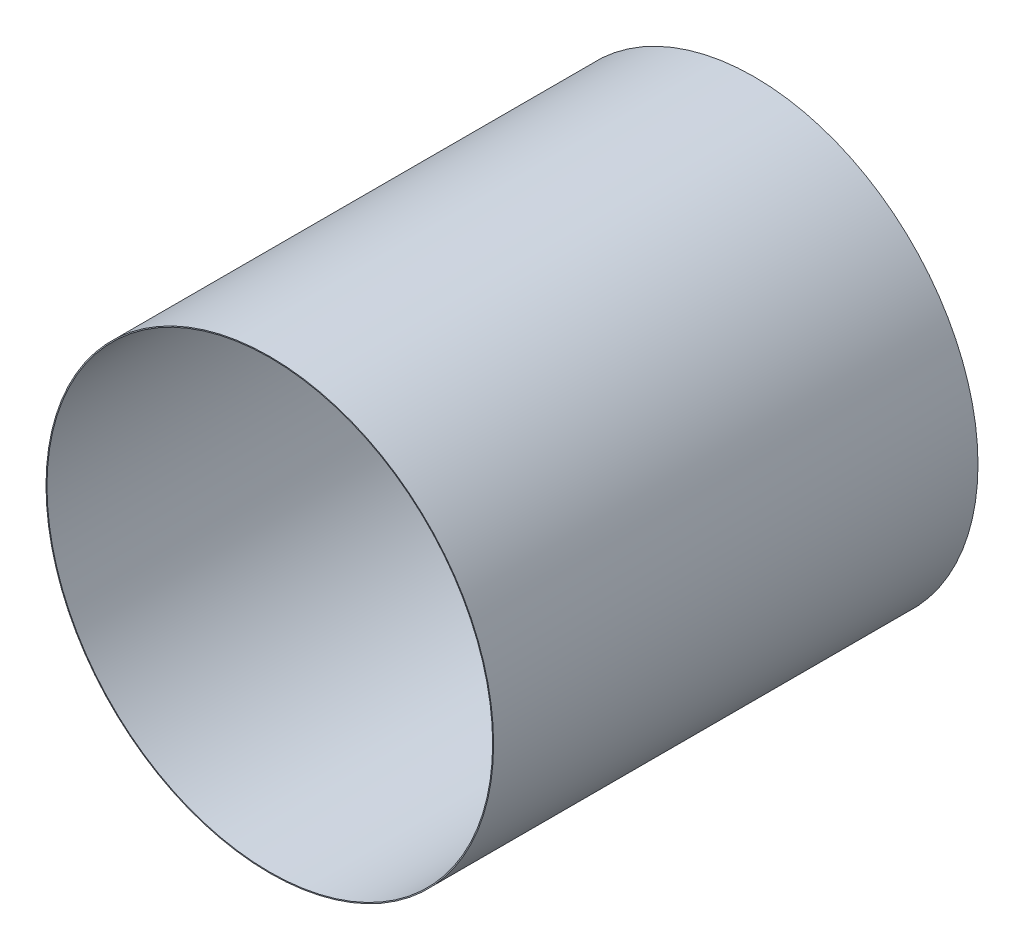
ISO-10303-21;
HEADER;
FILE_DESCRIPTION(('STEP AP214'),'2;1');
FILE_NAME('part.step','',(''),(''),'','','');
FILE_SCHEMA(('AUTOMOTIVE_DESIGN { 1 0 10303 214 1 1 1 1 }'));
ENDSEC;
DATA;
#1=APPLICATION_CONTEXT('core data for automotive mechanical design processes');
#2=APPLICATION_PROTOCOL_DEFINITION('international standard','automotive_design',2000,#1);
#3=PRODUCT_CONTEXT('',#1,'mechanical');
#4=PRODUCT('Part','Part','',(#3));
#5=PRODUCT_RELATED_PRODUCT_CATEGORY('part','',(#4));
#6=PRODUCT_DEFINITION_FORMATION('','',#4);
#7=PRODUCT_DEFINITION_CONTEXT('part definition',#1,'design');
#8=PRODUCT_DEFINITION('design','',#6,#7);
#9=PRODUCT_DEFINITION_SHAPE('','',#8);
#10=(LENGTH_UNIT() NAMED_UNIT(*) SI_UNIT(.MILLI.,.METRE.));
#11=(NAMED_UNIT(*) PLANE_ANGLE_UNIT() SI_UNIT($,.RADIAN.));
#12=(NAMED_UNIT(*) SI_UNIT($,.STERADIAN.) SOLID_ANGLE_UNIT());
#13=UNCERTAINTY_MEASURE_WITH_UNIT(LENGTH_MEASURE(1.E-05),#10,'distance_accuracy_value','');
#14=(GEOMETRIC_REPRESENTATION_CONTEXT(3) GLOBAL_UNCERTAINTY_ASSIGNED_CONTEXT((#13)) GLOBAL_UNIT_ASSIGNED_CONTEXT((#10,
#11,#12)) REPRESENTATION_CONTEXT('',''));
#15=CARTESIAN_POINT('',(0.,0.,0.));
#16=DIRECTION('',(0.,0.,1.));
#17=DIRECTION('',(1.,0.,0.));
#18=AXIS2_PLACEMENT_3D('',#15,#16,#17);
#19=CARTESIAN_POINT('',(0.,0.,25.));
#20=DIRECTION('',(0.,0.,1.));
#21=DIRECTION('',(1.,0.,0.));
#22=AXIS2_PLACEMENT_3D('',#19,#20,#21);
#23=PLANE('',#22);
#24=CARTESIAN_POINT('',(0.,0.,25.));
#25=DIRECTION('',(0.,0.,1.));
#26=DIRECTION('',(1.,0.,0.));
#27=AXIS2_PLACEMENT_3D('',#24,#25,#26);
#28=CIRCLE('',#27,11.55);
#29=CARTESIAN_POINT('',(11.55,0.,25.));
#30=VERTEX_POINT('',#29);
#31=EDGE_CURVE('E10',#30,#30,#28,.T.);
#32=ORIENTED_EDGE('',*,*,#31,.T.);
#33=EDGE_LOOP('',(#32));
#34=FACE_BOUND('',#33,.T.);
#35=CARTESIAN_POINT('',(0.,0.,25.));
#36=DIRECTION('',(0.,0.,1.));
#37=DIRECTION('',(1.,0.,0.));
#38=AXIS2_PLACEMENT_3D('',#35,#36,#37);
#39=CIRCLE('',#38,11.5);
#40=CARTESIAN_POINT('',(11.5,0.,25.));
#41=VERTEX_POINT('',#40);
#42=EDGE_CURVE('E42',#41,#41,#39,.T.);
#43=ORIENTED_EDGE('',*,*,#42,.F.);
#44=EDGE_LOOP('',(#43));
#45=FACE_BOUND('',#44,.T.);
#46=ADVANCED_FACE('F31',(#34,#45),#23,.T.);
#47=CARTESIAN_POINT('',(0.,0.,0.));
#48=DIRECTION('',(0.,0.,1.));
#49=DIRECTION('',(1.,0.,0.));
#50=AXIS2_PLACEMENT_3D('',#47,#48,#49);
#51=PLANE('',#50);
#52=CARTESIAN_POINT('',(0.,0.,0.));
#53=DIRECTION('',(0.,0.,1.));
#54=DIRECTION('',(1.,0.,0.));
#55=AXIS2_PLACEMENT_3D('',#52,#53,#54);
#56=CIRCLE('',#55,11.55);
#57=CARTESIAN_POINT('',(11.55,0.,0.));
#58=VERTEX_POINT('',#57);
#59=EDGE_CURVE('E35',#58,#58,#56,.T.);
#60=ORIENTED_EDGE('',*,*,#59,.F.);
#61=EDGE_LOOP('',(#60));
#62=FACE_BOUND('',#61,.T.);
#63=CARTESIAN_POINT('',(0.,0.,0.));
#64=DIRECTION('',(0.,0.,1.));
#65=DIRECTION('',(1.,0.,0.));
#66=AXIS2_PLACEMENT_3D('',#63,#64,#65);
#67=CIRCLE('',#66,11.5);
#68=CARTESIAN_POINT('',(11.5,0.,0.));
#69=VERTEX_POINT('',#68);
#70=EDGE_CURVE('E44',#69,#69,#67,.T.);
#71=ORIENTED_EDGE('',*,*,#70,.T.);
#72=EDGE_LOOP('',(#71));
#73=FACE_BOUND('',#72,.T.);
#74=ADVANCED_FACE('F54',(#62,#73),#51,.F.);
#75=CARTESIAN_POINT('',(0.,0.,25.));
#76=DIRECTION('',(0.,0.,-1.));
#77=DIRECTION('',(-1.,0.,0.));
#78=AXIS2_PLACEMENT_3D('',#75,#76,#77);
#79=CYLINDRICAL_SURFACE('',#78,11.55);
#80=ORIENTED_EDGE('',*,*,#31,.F.);
#81=EDGE_LOOP('',(#80));
#82=FACE_BOUND('',#81,.T.);
#83=ORIENTED_EDGE('',*,*,#59,.T.);
#84=EDGE_LOOP('',(#83));
#85=FACE_BOUND('',#84,.T.);
#86=ADVANCED_FACE('F33',(#82,#85),#79,.T.);
#87=CARTESIAN_POINT('',(0.,0.,25.));
#88=DIRECTION('',(0.,0.,-1.));
#89=DIRECTION('',(-1.,0.,0.));
#90=AXIS2_PLACEMENT_3D('',#87,#88,#89);
#91=CYLINDRICAL_SURFACE('',#90,11.5);
#92=ORIENTED_EDGE('',*,*,#42,.T.);
#93=EDGE_LOOP('',(#92));
#94=FACE_BOUND('',#93,.T.);
#95=ORIENTED_EDGE('',*,*,#70,.F.);
#96=EDGE_LOOP('',(#95));
#97=FACE_BOUND('',#96,.T.);
#98=ADVANCED_FACE('F50',(#94,#97),#91,.F.);
#99=CLOSED_SHELL('',(#46,#74,#86,#98));
#100=MANIFOLD_SOLID_BREP('B2',#99);
#101=ADVANCED_BREP_SHAPE_REPRESENTATION('',(#18,#100),#14);
#102=SHAPE_DEFINITION_REPRESENTATION(#9,#101);
ENDSEC;
END-ISO-10303-21;
